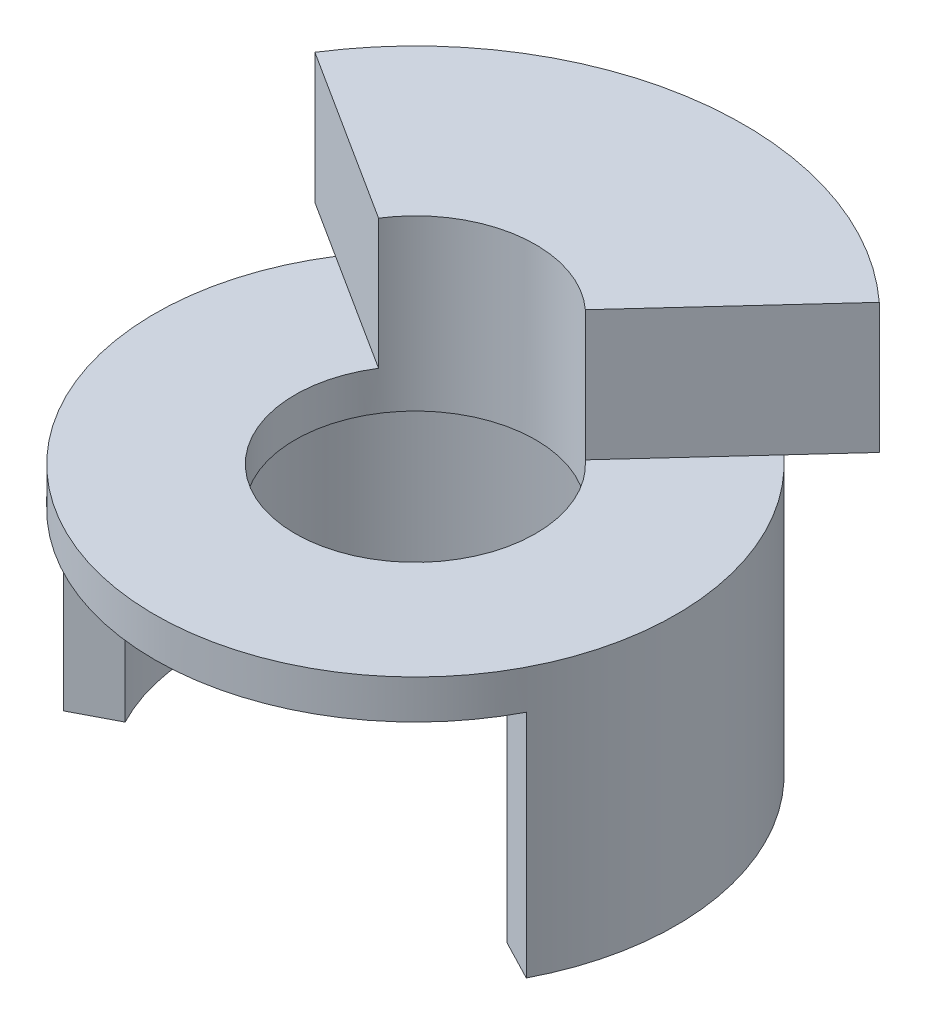
ISO-10303-21;
HEADER;
FILE_DESCRIPTION(('STEP AP214'),'2;1');
FILE_NAME('part.step','',(''),(''),'','','');
FILE_SCHEMA(('AUTOMOTIVE_DESIGN { 1 0 10303 214 1 1 1 1 }'));
ENDSEC;
DATA;
#1=APPLICATION_CONTEXT('core data for automotive mechanical design processes');
#2=APPLICATION_PROTOCOL_DEFINITION('international standard','automotive_design',2000,#1);
#3=PRODUCT_CONTEXT('',#1,'mechanical');
#4=PRODUCT('Part','Part','',(#3));
#5=PRODUCT_RELATED_PRODUCT_CATEGORY('part','',(#4));
#6=PRODUCT_DEFINITION_FORMATION('','',#4);
#7=PRODUCT_DEFINITION_CONTEXT('part definition',#1,'design');
#8=PRODUCT_DEFINITION('design','',#6,#7);
#9=PRODUCT_DEFINITION_SHAPE('','',#8);
#10=(LENGTH_UNIT() NAMED_UNIT(*) SI_UNIT(.MILLI.,.METRE.));
#11=(NAMED_UNIT(*) PLANE_ANGLE_UNIT() SI_UNIT($,.RADIAN.));
#12=(NAMED_UNIT(*) SI_UNIT($,.STERADIAN.) SOLID_ANGLE_UNIT());
#13=UNCERTAINTY_MEASURE_WITH_UNIT(LENGTH_MEASURE(1.E-05),#10,'distance_accuracy_value','');
#14=(GEOMETRIC_REPRESENTATION_CONTEXT(3) GLOBAL_UNCERTAINTY_ASSIGNED_CONTEXT((#13)) GLOBAL_UNIT_ASSIGNED_CONTEXT((#10,
#11,#12)) REPRESENTATION_CONTEXT('',''));
#15=CARTESIAN_POINT('',(0.,0.,0.));
#16=DIRECTION('',(0.,0.,1.));
#17=DIRECTION('',(1.,0.,0.));
#18=AXIS2_PLACEMENT_3D('',#15,#16,#17);
#19=CARTESIAN_POINT('',(0.,5.2578,0.));
#20=DIRECTION('',(0.,-1.,0.));
#21=DIRECTION('',(0.,0.,-1.));
#22=AXIS2_PLACEMENT_3D('',#19,#20,#21);
#23=CYLINDRICAL_SURFACE('',#22,5.0927);
#24=CARTESIAN_POINT('',(0.,5.2578,0.));
#25=DIRECTION('',(0.,1.,0.));
#26=DIRECTION('',(0.,0.,1.));
#27=AXIS2_PLACEMENT_3D('',#24,#25,#26);
#28=CIRCLE('',#27,5.0927);
#29=CARTESIAN_POINT('',(3.44057825032431,5.2578,-3.75473229317289));
#30=VERTEX_POINT('',#29);
#31=CARTESIAN_POINT('',(-4.29513961609127,5.2578,-2.73630571542789));
#32=VERTEX_POINT('',#31);
#33=EDGE_CURVE('E178',#30,#32,#28,.T.);
#34=ORIENTED_EDGE('',*,*,#33,.F.);
#35=EDGE_CURVE('E183',#32,#30,#28,.T.);
#36=ORIENTED_EDGE('',*,*,#35,.F.);
#37=EDGE_LOOP('',(#34,#36));
#38=FACE_BOUND('',#37,.T.);
#39=CARTESIAN_POINT('',(0.,4.4958,0.));
#40=DIRECTION('',(0.,1.,0.));
#41=DIRECTION('',(0.,0.,1.));
#42=AXIS2_PLACEMENT_3D('',#39,#40,#41);
#43=CIRCLE('',#42,5.0927);
#44=CARTESIAN_POINT('',(4.51728007012674,4.4958,2.35154716262205));
#45=VERTEX_POINT('',#44);
#46=CARTESIAN_POINT('',(-4.51728007012674,4.4958,2.35154716262205));
#47=VERTEX_POINT('',#46);
#48=EDGE_CURVE('E158',#45,#47,#43,.F.);
#49=ORIENTED_EDGE('',*,*,#48,.F.);
#50=DIRECTION('',(0.,-1.,0.));
#51=VECTOR('',#50,1.);
#52=CARTESIAN_POINT('',(4.51728007012674,14.8668592620936,2.35154716262205));
#53=LINE('',#52,#51);
#54=CARTESIAN_POINT('',(4.51728007012674,0.,2.35154716262205));
#55=VERTEX_POINT('',#54);
#56=EDGE_CURVE('E151',#45,#55,#53,.T.);
#57=ORIENTED_EDGE('',*,*,#56,.T.);
#58=CARTESIAN_POINT('',(0.,0.,0.));
#59=DIRECTION('',(0.,1.,0.));
#60=DIRECTION('',(0.,0.,1.));
#61=AXIS2_PLACEMENT_3D('',#58,#59,#60);
#62=CIRCLE('',#61,5.0927);
#63=CARTESIAN_POINT('',(-4.51728007012674,0.,2.35154716262205));
#64=VERTEX_POINT('',#63);
#65=EDGE_CURVE('E177',#55,#64,#62,.T.);
#66=ORIENTED_EDGE('',*,*,#65,.T.);
#67=DIRECTION('',(0.,-1.,0.));
#68=VECTOR('',#67,1.);
#69=CARTESIAN_POINT('',(-4.51728007012674,14.8668592620936,2.35154716262205));
#70=LINE('',#69,#68);
#71=EDGE_CURVE('E157',#47,#64,#70,.T.);
#72=ORIENTED_EDGE('',*,*,#71,.F.);
#73=EDGE_LOOP('',(#49,#57,#66,#72));
#74=FACE_BOUND('',#73,.T.);
#75=ADVANCED_FACE('F41',(#38,#74),#23,.T.);
#76=CARTESIAN_POINT('',(0.,5.2578,0.));
#77=DIRECTION('',(0.,1.,0.));
#78=DIRECTION('',(0.,0.,1.));
#79=AXIS2_PLACEMENT_3D('',#76,#77,#78);
#80=PLANE('',#79);
#81=DIRECTION('',(0.843391445812883,0.,0.537299608346828));
#82=VECTOR('',#81,1.);
#83=CARTESIAN_POINT('',(-5.40909103772093,5.2578,-3.44597103813238));
#84=LINE('',#83,#82);
#85=CARTESIAN_POINT('',(-1.98154820193737,5.2578,-1.26238542981087));
#86=VERTEX_POINT('',#85);
#87=EDGE_CURVE('E12',#32,#86,#84,.T.);
#88=ORIENTED_EDGE('',*,*,#87,.F.);
#89=ORIENTED_EDGE('',*,*,#35,.T.);
#90=DIRECTION('',(0.675590207615666,0.,-0.737277336810118));
#91=VECTOR('',#90,1.);
#92=CARTESIAN_POINT('',(4.33289779654308,5.2578,-4.72852819963169));
#93=LINE('',#92,#91);
#94=CARTESIAN_POINT('',(1.58729919279301,5.2578,-1.73223310283537));
#95=VERTEX_POINT('',#94);
#96=EDGE_CURVE('E231',#95,#30,#93,.T.);
#97=ORIENTED_EDGE('',*,*,#96,.F.);
#98=CARTESIAN_POINT('',(0.,5.2578,0.));
#99=DIRECTION('',(0.,1.,0.));
#100=DIRECTION('',(0.,0.,1.));
#101=AXIS2_PLACEMENT_3D('',#98,#99,#100);
#102=CIRCLE('',#101,2.3495);
#103=EDGE_CURVE('E61',#86,#95,#102,.T.);
#104=ORIENTED_EDGE('',*,*,#103,.F.);
#105=EDGE_LOOP('',(#88,#89,#97,#104));
#106=FACE_BOUND('',#105,.T.);
#107=ADVANCED_FACE('F221',(#106),#80,.T.);
#108=CARTESIAN_POINT('',(0.,0.,0.));
#109=DIRECTION('',(0.,1.,0.));
#110=DIRECTION('',(0.,0.,1.));
#111=AXIS2_PLACEMENT_3D('',#108,#109,#110);
#112=PLANE('',#111);
#113=ORIENTED_EDGE('',*,*,#65,.F.);
#114=DIRECTION('',(0.887010833178223,0.,0.461748613235032));
#115=VECTOR('',#114,1.);
#116=CARTESIAN_POINT('',(0.,0.,0.));
#117=LINE('',#116,#115);
#118=CARTESIAN_POINT('',(3.7287274394313,0.,1.9410526454561));
#119=VERTEX_POINT('',#118);
#120=EDGE_CURVE('E140',#119,#55,#117,.T.);
#121=ORIENTED_EDGE('',*,*,#120,.F.);
#122=CARTESIAN_POINT('',(0.,0.,0.));
#123=DIRECTION('',(0.,-1.,0.));
#124=DIRECTION('',(0.,0.,-1.));
#125=AXIS2_PLACEMENT_3D('',#122,#123,#124);
#126=CIRCLE('',#125,4.2037);
#127=CARTESIAN_POINT('',(-3.7287274394313,0.,1.9410526454561));
#128=VERTEX_POINT('',#127);
#129=EDGE_CURVE('E156',#128,#119,#126,.T.);
#130=ORIENTED_EDGE('',*,*,#129,.F.);
#131=DIRECTION('',(0.887010833178223,0.,-0.461748613235032));
#132=VECTOR('',#131,1.);
#133=CARTESIAN_POINT('',(0.,0.,0.));
#134=LINE('',#133,#132);
#135=EDGE_CURVE('E136',#64,#128,#134,.T.);
#136=ORIENTED_EDGE('',*,*,#135,.F.);
#137=EDGE_LOOP('',(#113,#121,#130,#136));
#138=FACE_BOUND('',#137,.T.);
#139=ADVANCED_FACE('F209',(#138),#112,.F.);
#140=CARTESIAN_POINT('',(0.,0.,0.));
#141=DIRECTION('',(0.,1.,0.));
#142=DIRECTION('',(0.,0.,1.));
#143=AXIS2_PLACEMENT_3D('',#140,#141,#142);
#144=CYLINDRICAL_SURFACE('',#143,2.3495);
#145=CARTESIAN_POINT('',(0.,4.4958,0.));
#146=DIRECTION('',(0.,1.,0.));
#147=DIRECTION('',(0.,0.,1.));
#148=AXIS2_PLACEMENT_3D('',#145,#146,#147);
#149=CIRCLE('',#148,2.3495);
#150=CARTESIAN_POINT('',(0.,4.4958,2.3495));
#151=VERTEX_POINT('',#150);
#152=EDGE_CURVE('E174',#151,#151,#149,.F.);
#153=ORIENTED_EDGE('',*,*,#152,.T.);
#154=EDGE_LOOP('',(#153));
#155=FACE_BOUND('',#154,.T.);
#156=ORIENTED_EDGE('',*,*,#103,.T.);
#157=DIRECTION('',(0.,-1.,0.));
#158=VECTOR('',#157,1.);
#159=CARTESIAN_POINT('',(1.58729919279301,7.7978,-1.73223310283537));
#160=LINE('',#159,#158);
#161=CARTESIAN_POINT('',(1.58729919279301,7.7978,-1.73223310283537));
#162=VERTEX_POINT('',#161);
#163=EDGE_CURVE('E116',#162,#95,#160,.T.);
#164=ORIENTED_EDGE('',*,*,#163,.F.);
#165=CARTESIAN_POINT('',(0.,7.7978,0.));
#166=DIRECTION('',(0.,-1.,0.));
#167=DIRECTION('',(0.,0.,-1.));
#168=AXIS2_PLACEMENT_3D('',#165,#166,#167);
#169=CIRCLE('',#168,2.3495);
#170=CARTESIAN_POINT('',(-1.98154820193737,7.7978,-1.26238542981087));
#171=VERTEX_POINT('',#170);
#172=EDGE_CURVE('E123',#171,#162,#169,.T.);
#173=ORIENTED_EDGE('',*,*,#172,.F.);
#174=DIRECTION('',(0.,-1.,0.));
#175=VECTOR('',#174,1.);
#176=CARTESIAN_POINT('',(-1.98154820193737,7.7978,-1.26238542981087));
#177=LINE('',#176,#175);
#178=EDGE_CURVE('E246',#171,#86,#177,.T.);
#179=ORIENTED_EDGE('',*,*,#178,.T.);
#180=EDGE_LOOP('',(#156,#164,#173,#179));
#181=FACE_BOUND('',#180,.T.);
#182=ADVANCED_FACE('F134',(#155,#181),#144,.F.);
#183=CARTESIAN_POINT('',(0.,4.4958,0.));
#184=DIRECTION('',(0.,1.,0.));
#185=DIRECTION('',(0.,0.,1.));
#186=AXIS2_PLACEMENT_3D('',#183,#184,#185);
#187=PLANE('',#186);
#188=ORIENTED_EDGE('',*,*,#152,.F.);
#189=EDGE_LOOP('',(#188));
#190=FACE_BOUND('',#189,.T.);
#191=CARTESIAN_POINT('',(0.,4.4958,0.));
#192=DIRECTION('',(0.,1.,0.));
#193=DIRECTION('',(0.,0.,1.));
#194=AXIS2_PLACEMENT_3D('',#191,#192,#193);
#195=CIRCLE('',#194,4.2037);
#196=CARTESIAN_POINT('',(-3.7287274394313,4.4958,1.9410526454561));
#197=VERTEX_POINT('',#196);
#198=CARTESIAN_POINT('',(3.7287274394313,4.4958,1.9410526454561));
#199=VERTEX_POINT('',#198);
#200=EDGE_CURVE('E170',#197,#199,#195,.F.);
#201=ORIENTED_EDGE('',*,*,#200,.T.);
#202=DIRECTION('',(0.887010833178223,0.,0.461748613235032));
#203=VECTOR('',#202,1.);
#204=CARTESIAN_POINT('',(0.,4.4958,0.));
#205=LINE('',#204,#203);
#206=EDGE_CURVE('E147',#199,#45,#205,.T.);
#207=ORIENTED_EDGE('',*,*,#206,.T.);
#208=ORIENTED_EDGE('',*,*,#48,.T.);
#209=DIRECTION('',(0.887010833178223,0.,-0.461748613235032));
#210=VECTOR('',#209,1.);
#211=CARTESIAN_POINT('',(0.,4.4958,0.));
#212=LINE('',#211,#210);
#213=EDGE_CURVE('E152',#47,#197,#212,.T.);
#214=ORIENTED_EDGE('',*,*,#213,.T.);
#215=EDGE_LOOP('',(#201,#207,#208,#214));
#216=FACE_BOUND('',#215,.T.);
#217=ADVANCED_FACE('F200',(#190,#216),#187,.F.);
#218=CARTESIAN_POINT('',(0.,17.1476591042956,0.));
#219=DIRECTION('',(0.,-1.,0.));
#220=DIRECTION('',(0.,0.,-1.));
#221=AXIS2_PLACEMENT_3D('',#218,#219,#220);
#222=CYLINDRICAL_SURFACE('',#221,4.2037);
#223=ORIENTED_EDGE('',*,*,#129,.T.);
#224=DIRECTION('',(0.,-1.,0.));
#225=VECTOR('',#224,1.);
#226=CARTESIAN_POINT('',(3.7287274394313,17.1476591042956,1.9410526454561));
#227=LINE('',#226,#225);
#228=EDGE_CURVE('E44',#119,#199,#227,.F.);
#229=ORIENTED_EDGE('',*,*,#228,.T.);
#230=ORIENTED_EDGE('',*,*,#200,.F.);
#231=DIRECTION('',(0.,-1.,0.));
#232=VECTOR('',#231,1.);
#233=CARTESIAN_POINT('',(-3.7287274394313,17.1476591042956,1.9410526454561));
#234=LINE('',#233,#232);
#235=EDGE_CURVE('E182',#197,#128,#234,.T.);
#236=ORIENTED_EDGE('',*,*,#235,.T.);
#237=EDGE_LOOP('',(#223,#229,#230,#236));
#238=FACE_BOUND('',#237,.T.);
#239=ADVANCED_FACE('F196',(#238),#222,.F.);
#240=CARTESIAN_POINT('',(0.,14.8668592620936,0.));
#241=DIRECTION('',(0.461748613235032,0.,-0.887010833178223));
#242=DIRECTION('',(-0.887010833178223,0.,-0.461748613235032));
#243=AXIS2_PLACEMENT_3D('',#240,#241,#242);
#244=PLANE('',#243);
#245=ORIENTED_EDGE('',*,*,#120,.T.);
#246=ORIENTED_EDGE('',*,*,#56,.F.);
#247=ORIENTED_EDGE('',*,*,#206,.F.);
#248=ORIENTED_EDGE('',*,*,#228,.F.);
#249=EDGE_LOOP('',(#245,#246,#247,#248));
#250=FACE_BOUND('',#249,.T.);
#251=ADVANCED_FACE('F211',(#250),#244,.F.);
#252=CARTESIAN_POINT('',(0.,14.8668592620936,0.));
#253=DIRECTION('',(-0.461748613235032,0.,-0.887010833178223));
#254=DIRECTION('',(-0.887010833178223,0.,0.461748613235032));
#255=AXIS2_PLACEMENT_3D('',#252,#253,#254);
#256=PLANE('',#255);
#257=ORIENTED_EDGE('',*,*,#213,.F.);
#258=ORIENTED_EDGE('',*,*,#71,.T.);
#259=ORIENTED_EDGE('',*,*,#135,.T.);
#260=ORIENTED_EDGE('',*,*,#235,.F.);
#261=EDGE_LOOP('',(#257,#258,#259,#260));
#262=FACE_BOUND('',#261,.T.);
#263=ADVANCED_FACE('F205',(#262),#256,.F.);
#264=CARTESIAN_POINT('',(4.33289779654308,7.7978,-4.72852819963169));
#265=DIRECTION('',(-0.737277336810118,0.,-0.675590207615667));
#266=DIRECTION('',(-0.675590207615667,0.,0.737277336810118));
#267=AXIS2_PLACEMENT_3D('',#264,#265,#266);
#268=PLANE('',#267);
#269=ORIENTED_EDGE('',*,*,#96,.T.);
#270=CARTESIAN_POINT('',(4.33289779654308,5.2578,-4.72852819963169));
#271=VERTEX_POINT('',#270);
#272=EDGE_CURVE('E234',#30,#271,#93,.T.);
#273=ORIENTED_EDGE('',*,*,#272,.T.);
#274=DIRECTION('',(0.,-1.,0.));
#275=VECTOR('',#274,1.);
#276=CARTESIAN_POINT('',(4.33289779654308,7.7978,-4.72852819963169));
#277=LINE('',#276,#275);
#278=CARTESIAN_POINT('',(4.33289779654308,7.7978,-4.72852819963169));
#279=VERTEX_POINT('',#278);
#280=EDGE_CURVE('E118',#279,#271,#277,.T.);
#281=ORIENTED_EDGE('',*,*,#280,.F.);
#282=DIRECTION('',(0.675590207615666,0.,-0.737277336810118));
#283=VECTOR('',#282,1.);
#284=CARTESIAN_POINT('',(4.33289779654308,7.7978,-4.72852819963169));
#285=LINE('',#284,#283);
#286=EDGE_CURVE('E111',#162,#279,#285,.T.);
#287=ORIENTED_EDGE('',*,*,#286,.F.);
#288=ORIENTED_EDGE('',*,*,#163,.T.);
#289=EDGE_LOOP('',(#269,#273,#281,#287,#288));
#290=FACE_BOUND('',#289,.T.);
#291=ADVANCED_FACE('F114',(#290),#268,.F.);
#292=CARTESIAN_POINT('',(0.,7.7978,0.));
#293=DIRECTION('',(0.,-1.,0.));
#294=DIRECTION('',(0.,0.,-1.));
#295=AXIS2_PLACEMENT_3D('',#292,#293,#294);
#296=CYLINDRICAL_SURFACE('',#295,6.4135);
#297=CARTESIAN_POINT('',(0.,5.2578,0.));
#298=DIRECTION('',(0.,1.,0.));
#299=DIRECTION('',(0.,0.,1.));
#300=AXIS2_PLACEMENT_3D('',#297,#298,#299);
#301=CIRCLE('',#300,6.4135);
#302=CARTESIAN_POINT('',(-5.40909103772093,5.2578,-3.44597103813238));
#303=VERTEX_POINT('',#302);
#304=EDGE_CURVE('E236',#271,#303,#301,.T.);
#305=ORIENTED_EDGE('',*,*,#304,.T.);
#306=DIRECTION('',(0.,-1.,0.));
#307=VECTOR('',#306,1.);
#308=CARTESIAN_POINT('',(-5.40909103772093,7.7978,-3.44597103813238));
#309=LINE('',#308,#307);
#310=CARTESIAN_POINT('',(-5.40909103772093,7.7978,-3.44597103813238));
#311=VERTEX_POINT('',#310);
#312=EDGE_CURVE('E142',#311,#303,#309,.T.);
#313=ORIENTED_EDGE('',*,*,#312,.F.);
#314=CARTESIAN_POINT('',(0.,7.7978,0.));
#315=DIRECTION('',(0.,1.,0.));
#316=DIRECTION('',(0.,0.,1.));
#317=AXIS2_PLACEMENT_3D('',#314,#315,#316);
#318=CIRCLE('',#317,6.4135);
#319=EDGE_CURVE('E122',#279,#311,#318,.T.);
#320=ORIENTED_EDGE('',*,*,#319,.F.);
#321=ORIENTED_EDGE('',*,*,#280,.T.);
#322=EDGE_LOOP('',(#305,#313,#320,#321));
#323=FACE_BOUND('',#322,.T.);
#324=ADVANCED_FACE('F254',(#323),#296,.T.);
#325=CARTESIAN_POINT('',(-5.40909103772093,7.7978,-3.44597103813238));
#326=DIRECTION('',(0.537299608346828,0.,-0.843391445812883));
#327=DIRECTION('',(-0.843391445812883,0.,-0.537299608346828));
#328=AXIS2_PLACEMENT_3D('',#325,#326,#327);
#329=PLANE('',#328);
#330=EDGE_CURVE('E51',#303,#32,#84,.T.);
#331=ORIENTED_EDGE('',*,*,#330,.T.);
#332=ORIENTED_EDGE('',*,*,#87,.T.);
#333=ORIENTED_EDGE('',*,*,#178,.F.);
#334=DIRECTION('',(0.843391445812883,0.,0.537299608346828));
#335=VECTOR('',#334,1.);
#336=CARTESIAN_POINT('',(-5.40909103772093,7.7978,-3.44597103813238));
#337=LINE('',#336,#335);
#338=EDGE_CURVE('E128',#311,#171,#337,.T.);
#339=ORIENTED_EDGE('',*,*,#338,.F.);
#340=ORIENTED_EDGE('',*,*,#312,.T.);
#341=EDGE_LOOP('',(#331,#332,#333,#339,#340));
#342=FACE_BOUND('',#341,.T.);
#343=ADVANCED_FACE('F252',(#342),#329,.F.);
#344=CARTESIAN_POINT('',(0.,7.7978,0.));
#345=DIRECTION('',(0.,-1.,0.));
#346=DIRECTION('',(0.,0.,-1.));
#347=AXIS2_PLACEMENT_3D('',#344,#345,#346);
#348=PLANE('',#347);
#349=ORIENTED_EDGE('',*,*,#172,.T.);
#350=ORIENTED_EDGE('',*,*,#286,.T.);
#351=ORIENTED_EDGE('',*,*,#319,.T.);
#352=ORIENTED_EDGE('',*,*,#338,.T.);
#353=EDGE_LOOP('',(#349,#350,#351,#352));
#354=FACE_BOUND('',#353,.T.);
#355=ADVANCED_FACE('F126',(#354),#348,.F.);
#356=CARTESIAN_POINT('',(0.,5.2578,0.));
#357=DIRECTION('',(0.,-1.,0.));
#358=DIRECTION('',(0.,0.,-1.));
#359=AXIS2_PLACEMENT_3D('',#356,#357,#358);
#360=PLANE('',#359);
#361=ORIENTED_EDGE('',*,*,#272,.F.);
#362=ORIENTED_EDGE('',*,*,#33,.T.);
#363=ORIENTED_EDGE('',*,*,#330,.F.);
#364=ORIENTED_EDGE('',*,*,#304,.F.);
#365=EDGE_LOOP('',(#361,#362,#363,#364));
#366=FACE_BOUND('',#365,.T.);
#367=ADVANCED_FACE('F235',(#366),#360,.T.);
#368=CLOSED_SHELL('',(#75,#107,#139,#182,#217,#239,#251,#263,#291,#324,#343,#355,#367));
#369=MANIFOLD_SOLID_BREP('B2',#368);
#370=ADVANCED_BREP_SHAPE_REPRESENTATION('',(#18,#369),#14);
#371=SHAPE_DEFINITION_REPRESENTATION(#9,#370);
ENDSEC;
END-ISO-10303-21;
